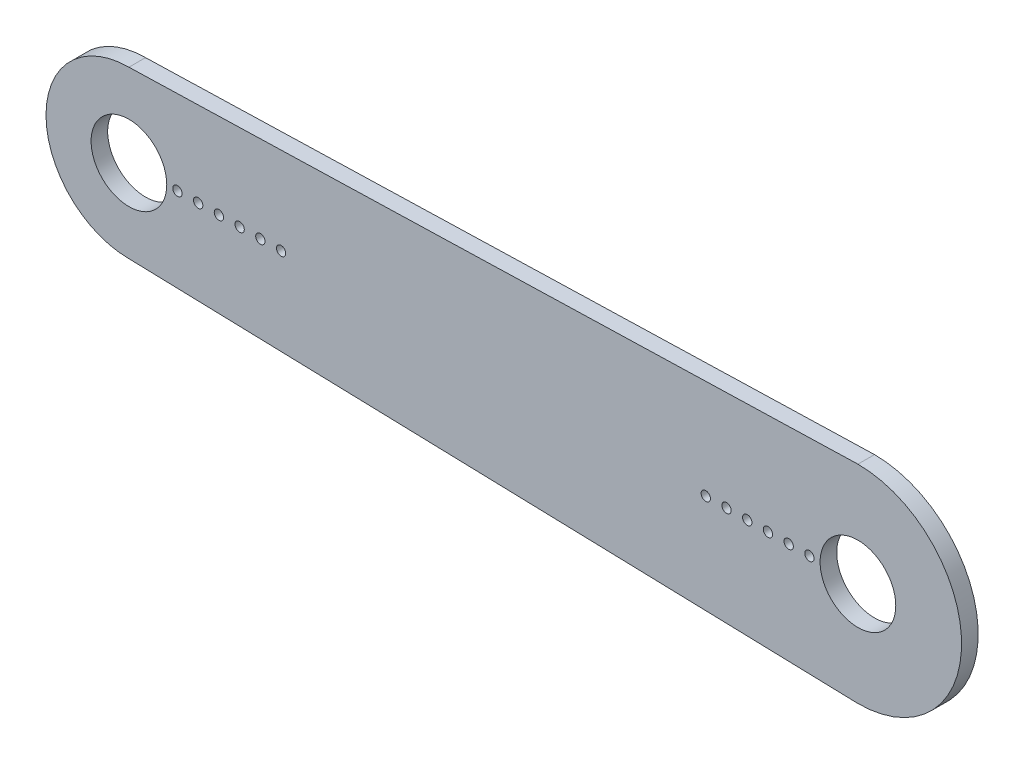
ISO-10303-21;
HEADER;
FILE_DESCRIPTION(('STEP AP214'),'2;1');
FILE_NAME('part.step','',(''),(''),'','','');
FILE_SCHEMA(('AUTOMOTIVE_DESIGN { 1 0 10303 214 1 1 1 1 }'));
ENDSEC;
DATA;
#1=APPLICATION_CONTEXT('core data for automotive mechanical design processes');
#2=APPLICATION_PROTOCOL_DEFINITION('international standard','automotive_design',2000,#1);
#3=PRODUCT_CONTEXT('',#1,'mechanical');
#4=PRODUCT('Part','Part','',(#3));
#5=PRODUCT_RELATED_PRODUCT_CATEGORY('part','',(#4));
#6=PRODUCT_DEFINITION_FORMATION('','',#4);
#7=PRODUCT_DEFINITION_CONTEXT('part definition',#1,'design');
#8=PRODUCT_DEFINITION('design','',#6,#7);
#9=PRODUCT_DEFINITION_SHAPE('','',#8);
#10=(LENGTH_UNIT() NAMED_UNIT(*) SI_UNIT(.MILLI.,.METRE.));
#11=(NAMED_UNIT(*) PLANE_ANGLE_UNIT() SI_UNIT($,.RADIAN.));
#12=(NAMED_UNIT(*) SI_UNIT($,.STERADIAN.) SOLID_ANGLE_UNIT());
#13=UNCERTAINTY_MEASURE_WITH_UNIT(LENGTH_MEASURE(1.E-05),#10,'distance_accuracy_value','');
#14=(GEOMETRIC_REPRESENTATION_CONTEXT(3) GLOBAL_UNCERTAINTY_ASSIGNED_CONTEXT((#13)) GLOBAL_UNIT_ASSIGNED_CONTEXT((#10,
#11,#12)) REPRESENTATION_CONTEXT('',''));
#15=CARTESIAN_POINT('',(0.,0.,0.));
#16=DIRECTION('',(0.,0.,1.));
#17=DIRECTION('',(1.,0.,0.));
#18=AXIS2_PLACEMENT_3D('',#15,#16,#17);
#19=CARTESIAN_POINT('',(-32.4159025710339,-9.07817709168111,1.6));
#20=DIRECTION('',(-0.028425875249851,-0.999595903161012,0.));
#21=DIRECTION('',(0.999595903161012,-0.028425875249851,0.));
#22=AXIS2_PLACEMENT_3D('',#19,#20,#21);
#23=PLANE('',#22);
#24=DIRECTION('',(-0.999595903161012,0.028425875249851,0.));
#25=VECTOR('',#24,1.);
#26=CARTESIAN_POINT('',(-32.4159025710339,-9.07817709168111,0.));
#27=LINE('',#26,#25);
#28=CARTESIAN_POINT('',(0.,-10.,0.));
#29=VERTEX_POINT('',#28);
#30=CARTESIAN_POINT('',(-70.33,-8.00000000000001,0.));
#31=VERTEX_POINT('',#30);
#32=EDGE_CURVE('E104',#29,#31,#27,.T.);
#33=ORIENTED_EDGE('',*,*,#32,.F.);
#34=DIRECTION('',(0.,0.,-1.));
#35=VECTOR('',#34,1.);
#36=CARTESIAN_POINT('',(0.,-10.,1.6));
#37=LINE('',#36,#35);
#38=CARTESIAN_POINT('',(0.,-10.,1.6));
#39=VERTEX_POINT('',#38);
#40=EDGE_CURVE('E11',#39,#29,#37,.T.);
#41=ORIENTED_EDGE('',*,*,#40,.F.);
#42=DIRECTION('',(-0.999595903161012,0.028425875249851,0.));
#43=VECTOR('',#42,1.);
#44=CARTESIAN_POINT('',(-32.4159025710339,-9.07817709168111,1.6));
#45=LINE('',#44,#43);
#46=CARTESIAN_POINT('',(-70.33,-8.00000000000001,1.6));
#47=VERTEX_POINT('',#46);
#48=EDGE_CURVE('E82',#39,#47,#45,.T.);
#49=ORIENTED_EDGE('',*,*,#48,.T.);
#50=DIRECTION('',(0.,0.,-1.));
#51=VECTOR('',#50,1.);
#52=CARTESIAN_POINT('',(-70.33,-8.00000000000001,1.6));
#53=LINE('',#52,#51);
#54=EDGE_CURVE('E72',#47,#31,#53,.T.);
#55=ORIENTED_EDGE('',*,*,#54,.T.);
#56=EDGE_LOOP('',(#33,#41,#49,#55));
#57=FACE_BOUND('',#56,.T.);
#58=ADVANCED_FACE('F33',(#57),#23,.T.);
#59=CARTESIAN_POINT('',(0.,0.,1.6));
#60=DIRECTION('',(0.,0.,-1.));
#61=DIRECTION('',(-1.,0.,0.));
#62=AXIS2_PLACEMENT_3D('',#59,#60,#61);
#63=CYLINDRICAL_SURFACE('',#62,10.);
#64=CARTESIAN_POINT('',(0.,0.,0.));
#65=DIRECTION('',(0.,0.,1.));
#66=DIRECTION('',(1.,0.,0.));
#67=AXIS2_PLACEMENT_3D('',#64,#65,#66);
#68=CIRCLE('',#67,10.);
#69=CARTESIAN_POINT('',(0.,9.99999999999999,0.));
#70=VERTEX_POINT('',#69);
#71=EDGE_CURVE('E88',#29,#70,#68,.T.);
#72=ORIENTED_EDGE('',*,*,#71,.T.);
#73=DIRECTION('',(0.,0.,-1.));
#74=VECTOR('',#73,1.);
#75=CARTESIAN_POINT('',(0.,9.99999999999999,1.6));
#76=LINE('',#75,#74);
#77=CARTESIAN_POINT('',(0.,9.99999999999999,1.6));
#78=VERTEX_POINT('',#77);
#79=EDGE_CURVE('E42',#78,#70,#76,.T.);
#80=ORIENTED_EDGE('',*,*,#79,.F.);
#81=CARTESIAN_POINT('',(0.,0.,1.6));
#82=DIRECTION('',(0.,0.,1.));
#83=DIRECTION('',(1.,0.,0.));
#84=AXIS2_PLACEMENT_3D('',#81,#82,#83);
#85=CIRCLE('',#84,10.);
#86=EDGE_CURVE('E77',#39,#78,#85,.T.);
#87=ORIENTED_EDGE('',*,*,#86,.F.);
#88=ORIENTED_EDGE('',*,*,#40,.T.);
#89=EDGE_LOOP('',(#72,#80,#87,#88));
#90=FACE_BOUND('',#89,.T.);
#91=ADVANCED_FACE('F86',(#90),#63,.T.);
#92=CARTESIAN_POINT('',(-36.4271724817168,8.96410713829895,1.6));
#93=DIRECTION('',(-0.0284258752498512,0.999595903161012,0.));
#94=DIRECTION('',(-0.999595903161012,-0.0284258752498512,0.));
#95=AXIS2_PLACEMENT_3D('',#92,#93,#94);
#96=PLANE('',#95);
#97=DIRECTION('',(0.999595903161012,0.0284258752498512,0.));
#98=VECTOR('',#97,1.);
#99=CARTESIAN_POINT('',(-36.4271724817168,8.96410713829895,0.));
#100=LINE('',#99,#98);
#101=CARTESIAN_POINT('',(-70.33,7.99999999999998,0.));
#102=VERTEX_POINT('',#101);
#103=EDGE_CURVE('E108',#102,#70,#100,.T.);
#104=ORIENTED_EDGE('',*,*,#103,.F.);
#105=DIRECTION('',(0.,0.,-1.));
#106=VECTOR('',#105,1.);
#107=CARTESIAN_POINT('',(-70.33,7.99999999999998,1.6));
#108=LINE('',#107,#106);
#109=CARTESIAN_POINT('',(-70.33,7.99999999999998,1.6));
#110=VERTEX_POINT('',#109);
#111=EDGE_CURVE('E65',#110,#102,#108,.T.);
#112=ORIENTED_EDGE('',*,*,#111,.F.);
#113=DIRECTION('',(0.999595903161012,0.0284258752498512,0.));
#114=VECTOR('',#113,1.);
#115=CARTESIAN_POINT('',(-36.4271724817168,8.96410713829895,1.6));
#116=LINE('',#115,#114);
#117=EDGE_CURVE('E81',#110,#78,#116,.T.);
#118=ORIENTED_EDGE('',*,*,#117,.T.);
#119=ORIENTED_EDGE('',*,*,#79,.T.);
#120=EDGE_LOOP('',(#104,#112,#118,#119));
#121=FACE_BOUND('',#120,.T.);
#122=ADVANCED_FACE('F92',(#121),#96,.T.);
#123=CARTESIAN_POINT('',(0.,0.,1.6));
#124=DIRECTION('',(0.,0.,-1.));
#125=DIRECTION('',(-1.,0.,0.));
#126=AXIS2_PLACEMENT_3D('',#123,#124,#125);
#127=CYLINDRICAL_SURFACE('',#126,3.65);
#128=CARTESIAN_POINT('',(0.,0.,1.6));
#129=DIRECTION('',(0.,0.,1.));
#130=DIRECTION('',(1.,0.,0.));
#131=AXIS2_PLACEMENT_3D('',#128,#129,#130);
#132=CIRCLE('',#131,3.65);
#133=CARTESIAN_POINT('',(3.65,0.,1.6));
#134=VERTEX_POINT('',#133);
#135=EDGE_CURVE('E115',#134,#134,#132,.T.);
#136=ORIENTED_EDGE('',*,*,#135,.T.);
#137=EDGE_LOOP('',(#136));
#138=FACE_BOUND('',#137,.T.);
#139=CARTESIAN_POINT('',(0.,0.,0.));
#140=DIRECTION('',(0.,0.,1.));
#141=DIRECTION('',(1.,0.,0.));
#142=AXIS2_PLACEMENT_3D('',#139,#140,#141);
#143=CIRCLE('',#142,3.65);
#144=CARTESIAN_POINT('',(3.65,0.,0.));
#145=VERTEX_POINT('',#144);
#146=EDGE_CURVE('E100',#145,#145,#143,.T.);
#147=ORIENTED_EDGE('',*,*,#146,.F.);
#148=EDGE_LOOP('',(#147));
#149=FACE_BOUND('',#148,.T.);
#150=ADVANCED_FACE('F130',(#138,#149),#127,.F.);
#151=CARTESIAN_POINT('',(-70.33,0.,1.6));
#152=DIRECTION('',(0.,0.,-1.));
#153=DIRECTION('',(-1.,0.,0.));
#154=AXIS2_PLACEMENT_3D('',#151,#152,#153);
#155=CYLINDRICAL_SURFACE('',#154,3.65);
#156=CARTESIAN_POINT('',(-70.33,0.,1.6));
#157=DIRECTION('',(0.,0.,1.));
#158=DIRECTION('',(1.,0.,0.));
#159=AXIS2_PLACEMENT_3D('',#156,#157,#158);
#160=CIRCLE('',#159,3.65);
#161=CARTESIAN_POINT('',(-66.68,0.,1.6));
#162=VERTEX_POINT('',#161);
#163=EDGE_CURVE('E112',#162,#162,#160,.T.);
#164=ORIENTED_EDGE('',*,*,#163,.T.);
#165=EDGE_LOOP('',(#164));
#166=FACE_BOUND('',#165,.T.);
#167=CARTESIAN_POINT('',(-70.33,0.,0.));
#168=DIRECTION('',(0.,0.,1.));
#169=DIRECTION('',(1.,0.,0.));
#170=AXIS2_PLACEMENT_3D('',#167,#168,#169);
#171=CIRCLE('',#170,3.65);
#172=CARTESIAN_POINT('',(-66.68,0.,0.));
#173=VERTEX_POINT('',#172);
#174=EDGE_CURVE('E97',#173,#173,#171,.T.);
#175=ORIENTED_EDGE('',*,*,#174,.F.);
#176=EDGE_LOOP('',(#175));
#177=FACE_BOUND('',#176,.T.);
#178=ADVANCED_FACE('F35',(#166,#177),#155,.F.);
#179=CARTESIAN_POINT('',(-70.33,0.,1.6));
#180=DIRECTION('',(0.,0.,-1.));
#181=DIRECTION('',(-1.,0.,0.));
#182=AXIS2_PLACEMENT_3D('',#179,#180,#181);
#183=CYLINDRICAL_SURFACE('',#182,8.);
#184=CARTESIAN_POINT('',(-70.33,0.,0.));
#185=DIRECTION('',(0.,0.,1.));
#186=DIRECTION('',(1.,0.,0.));
#187=AXIS2_PLACEMENT_3D('',#184,#185,#186);
#188=CIRCLE('',#187,8.);
#189=EDGE_CURVE('E110',#102,#31,#188,.T.);
#190=ORIENTED_EDGE('',*,*,#189,.T.);
#191=ORIENTED_EDGE('',*,*,#54,.F.);
#192=CARTESIAN_POINT('',(-70.33,0.,1.6));
#193=DIRECTION('',(0.,0.,1.));
#194=DIRECTION('',(1.,0.,0.));
#195=AXIS2_PLACEMENT_3D('',#192,#193,#194);
#196=CIRCLE('',#195,8.);
#197=EDGE_CURVE('E50',#110,#47,#196,.T.);
#198=ORIENTED_EDGE('',*,*,#197,.F.);
#199=ORIENTED_EDGE('',*,*,#111,.T.);
#200=EDGE_LOOP('',(#190,#191,#198,#199));
#201=FACE_BOUND('',#200,.T.);
#202=ADVANCED_FACE('F137',(#201),#183,.T.);
#203=CARTESIAN_POINT('',(-34.165,-70.585188181273,1.6));
#204=DIRECTION('',(0.,0.,1.));
#205=DIRECTION('',(1.,0.,0.));
#206=AXIS2_PLACEMENT_3D('',#203,#204,#205);
#207=PLANE('',#206);
#208=CARTESIAN_POINT('',(-55.65,0.,1.6));
#209=DIRECTION('',(0.,0.,1.));
#210=DIRECTION('',(1.,0.,0.));
#211=AXIS2_PLACEMENT_3D('',#208,#209,#210);
#212=CIRCLE('',#211,0.450000000000002);
#213=CARTESIAN_POINT('',(-55.2,0.,1.6));
#214=VERTEX_POINT('',#213);
#215=EDGE_CURVE('E295',#214,#214,#212,.T.);
#216=ORIENTED_EDGE('',*,*,#215,.F.);
#217=EDGE_LOOP('',(#216));
#218=FACE_BOUND('',#217,.T.);
#219=CARTESIAN_POINT('',(-57.65,0.,1.6));
#220=DIRECTION('',(0.,0.,1.));
#221=DIRECTION('',(1.,0.,0.));
#222=AXIS2_PLACEMENT_3D('',#219,#220,#221);
#223=CIRCLE('',#222,0.450000000000002);
#224=CARTESIAN_POINT('',(-57.2,0.,1.6));
#225=VERTEX_POINT('',#224);
#226=EDGE_CURVE('E298',#225,#225,#223,.T.);
#227=ORIENTED_EDGE('',*,*,#226,.F.);
#228=EDGE_LOOP('',(#227));
#229=FACE_BOUND('',#228,.T.);
#230=CARTESIAN_POINT('',(-59.65,0.,1.6));
#231=DIRECTION('',(0.,0.,1.));
#232=DIRECTION('',(1.,0.,0.));
#233=AXIS2_PLACEMENT_3D('',#230,#231,#232);
#234=CIRCLE('',#233,0.450000000000002);
#235=CARTESIAN_POINT('',(-59.2,0.,1.6));
#236=VERTEX_POINT('',#235);
#237=EDGE_CURVE('E307',#236,#236,#234,.T.);
#238=ORIENTED_EDGE('',*,*,#237,.F.);
#239=EDGE_LOOP('',(#238));
#240=FACE_BOUND('',#239,.T.);
#241=CARTESIAN_POINT('',(-61.65,0.,1.6));
#242=DIRECTION('',(0.,0.,1.));
#243=DIRECTION('',(1.,0.,0.));
#244=AXIS2_PLACEMENT_3D('',#241,#242,#243);
#245=CIRCLE('',#244,0.450000000000002);
#246=CARTESIAN_POINT('',(-61.2,0.,1.6));
#247=VERTEX_POINT('',#246);
#248=EDGE_CURVE('E313',#247,#247,#245,.T.);
#249=ORIENTED_EDGE('',*,*,#248,.F.);
#250=EDGE_LOOP('',(#249));
#251=FACE_BOUND('',#250,.T.);
#252=CARTESIAN_POINT('',(-63.65,0.,1.6));
#253=DIRECTION('',(0.,0.,1.));
#254=DIRECTION('',(1.,0.,0.));
#255=AXIS2_PLACEMENT_3D('',#252,#253,#254);
#256=CIRCLE('',#255,0.450000000000002);
#257=CARTESIAN_POINT('',(-63.2,0.,1.6));
#258=VERTEX_POINT('',#257);
#259=EDGE_CURVE('E319',#258,#258,#256,.T.);
#260=ORIENTED_EDGE('',*,*,#259,.F.);
#261=EDGE_LOOP('',(#260));
#262=FACE_BOUND('',#261,.T.);
#263=CARTESIAN_POINT('',(-14.68,0.,1.6));
#264=DIRECTION('',(0.,0.,1.));
#265=DIRECTION('',(1.,0.,0.));
#266=AXIS2_PLACEMENT_3D('',#263,#264,#265);
#267=CIRCLE('',#266,0.45);
#268=CARTESIAN_POINT('',(-14.23,0.,1.6));
#269=VERTEX_POINT('',#268);
#270=EDGE_CURVE('E325',#269,#269,#267,.T.);
#271=ORIENTED_EDGE('',*,*,#270,.F.);
#272=EDGE_LOOP('',(#271));
#273=FACE_BOUND('',#272,.T.);
#274=CARTESIAN_POINT('',(-12.68,0.,1.6));
#275=DIRECTION('',(0.,0.,1.));
#276=DIRECTION('',(1.,0.,0.));
#277=AXIS2_PLACEMENT_3D('',#274,#275,#276);
#278=CIRCLE('',#277,0.45);
#279=CARTESIAN_POINT('',(-12.23,0.,1.6));
#280=VERTEX_POINT('',#279);
#281=EDGE_CURVE('E331',#280,#280,#278,.T.);
#282=ORIENTED_EDGE('',*,*,#281,.F.);
#283=EDGE_LOOP('',(#282));
#284=FACE_BOUND('',#283,.T.);
#285=CARTESIAN_POINT('',(-10.68,0.,1.6));
#286=DIRECTION('',(0.,0.,1.));
#287=DIRECTION('',(1.,0.,0.));
#288=AXIS2_PLACEMENT_3D('',#285,#286,#287);
#289=CIRCLE('',#288,0.45);
#290=CARTESIAN_POINT('',(-10.23,0.,1.6));
#291=VERTEX_POINT('',#290);
#292=EDGE_CURVE('E337',#291,#291,#289,.T.);
#293=ORIENTED_EDGE('',*,*,#292,.F.);
#294=EDGE_LOOP('',(#293));
#295=FACE_BOUND('',#294,.T.);
#296=CARTESIAN_POINT('',(-8.68,0.,1.6));
#297=DIRECTION('',(0.,0.,1.));
#298=DIRECTION('',(1.,0.,0.));
#299=AXIS2_PLACEMENT_3D('',#296,#297,#298);
#300=CIRCLE('',#299,0.45);
#301=CARTESIAN_POINT('',(-8.23,0.,1.6));
#302=VERTEX_POINT('',#301);
#303=EDGE_CURVE('E343',#302,#302,#300,.T.);
#304=ORIENTED_EDGE('',*,*,#303,.F.);
#305=EDGE_LOOP('',(#304));
#306=FACE_BOUND('',#305,.T.);
#307=CARTESIAN_POINT('',(-6.68,0.,1.6));
#308=DIRECTION('',(0.,0.,1.));
#309=DIRECTION('',(1.,0.,0.));
#310=AXIS2_PLACEMENT_3D('',#307,#308,#309);
#311=CIRCLE('',#310,0.45);
#312=CARTESIAN_POINT('',(-6.23,0.,1.6));
#313=VERTEX_POINT('',#312);
#314=EDGE_CURVE('E349',#313,#313,#311,.T.);
#315=ORIENTED_EDGE('',*,*,#314,.F.);
#316=EDGE_LOOP('',(#315));
#317=FACE_BOUND('',#316,.T.);
#318=CARTESIAN_POINT('',(-4.68,0.,1.6));
#319=DIRECTION('',(0.,0.,1.));
#320=DIRECTION('',(1.,0.,0.));
#321=AXIS2_PLACEMENT_3D('',#318,#319,#320);
#322=CIRCLE('',#321,0.45);
#323=CARTESIAN_POINT('',(-4.23,0.,1.6));
#324=VERTEX_POINT('',#323);
#325=EDGE_CURVE('E355',#324,#324,#322,.T.);
#326=ORIENTED_EDGE('',*,*,#325,.F.);
#327=EDGE_LOOP('',(#326));
#328=FACE_BOUND('',#327,.T.);
#329=CARTESIAN_POINT('',(-65.65,0.,1.6));
#330=DIRECTION('',(0.,0.,1.));
#331=DIRECTION('',(1.,0.,0.));
#332=AXIS2_PLACEMENT_3D('',#329,#330,#331);
#333=CIRCLE('',#332,0.450000000000002);
#334=CARTESIAN_POINT('',(-65.2,0.,1.6));
#335=VERTEX_POINT('',#334);
#336=EDGE_CURVE('E360',#335,#335,#333,.T.);
#337=ORIENTED_EDGE('',*,*,#336,.F.);
#338=EDGE_LOOP('',(#337));
#339=FACE_BOUND('',#338,.T.);
#340=ORIENTED_EDGE('',*,*,#163,.F.);
#341=EDGE_LOOP('',(#340));
#342=FACE_BOUND('',#341,.T.);
#343=ORIENTED_EDGE('',*,*,#135,.F.);
#344=EDGE_LOOP('',(#343));
#345=FACE_BOUND('',#344,.T.);
#346=ORIENTED_EDGE('',*,*,#48,.F.);
#347=ORIENTED_EDGE('',*,*,#86,.T.);
#348=ORIENTED_EDGE('',*,*,#117,.F.);
#349=ORIENTED_EDGE('',*,*,#197,.T.);
#350=EDGE_LOOP('',(#346,#347,#348,#349));
#351=FACE_BOUND('',#350,.T.);
#352=ADVANCED_FACE('F79',(#218,#229,#240,#251,#262,#273,#284,#295,#306,#317,#328,#339,#342,#345,
#351),#207,.T.);
#353=CARTESIAN_POINT('',(-34.165,-70.585188181273,0.));
#354=DIRECTION('',(0.,0.,1.));
#355=DIRECTION('',(1.,0.,0.));
#356=AXIS2_PLACEMENT_3D('',#353,#354,#355);
#357=PLANE('',#356);
#358=CARTESIAN_POINT('',(-55.65,0.,0.));
#359=DIRECTION('',(0.,0.,1.));
#360=DIRECTION('',(1.,0.,0.));
#361=AXIS2_PLACEMENT_3D('',#358,#359,#360);
#362=CIRCLE('',#361,0.450000000000002);
#363=CARTESIAN_POINT('',(-55.2,0.,0.));
#364=VERTEX_POINT('',#363);
#365=EDGE_CURVE('E297',#364,#364,#362,.F.);
#366=ORIENTED_EDGE('',*,*,#365,.F.);
#367=EDGE_LOOP('',(#366));
#368=FACE_BOUND('',#367,.T.);
#369=CARTESIAN_POINT('',(-57.65,0.,0.));
#370=DIRECTION('',(0.,0.,1.));
#371=DIRECTION('',(1.,0.,0.));
#372=AXIS2_PLACEMENT_3D('',#369,#370,#371);
#373=CIRCLE('',#372,0.450000000000002);
#374=CARTESIAN_POINT('',(-57.2,0.,0.));
#375=VERTEX_POINT('',#374);
#376=EDGE_CURVE('E301',#375,#375,#373,.F.);
#377=ORIENTED_EDGE('',*,*,#376,.F.);
#378=EDGE_LOOP('',(#377));
#379=FACE_BOUND('',#378,.T.);
#380=CARTESIAN_POINT('',(-59.65,0.,0.));
#381=DIRECTION('',(0.,0.,1.));
#382=DIRECTION('',(1.,0.,0.));
#383=AXIS2_PLACEMENT_3D('',#380,#381,#382);
#384=CIRCLE('',#383,0.450000000000002);
#385=CARTESIAN_POINT('',(-59.2,0.,0.));
#386=VERTEX_POINT('',#385);
#387=EDGE_CURVE('E310',#386,#386,#384,.F.);
#388=ORIENTED_EDGE('',*,*,#387,.F.);
#389=EDGE_LOOP('',(#388));
#390=FACE_BOUND('',#389,.T.);
#391=CARTESIAN_POINT('',(-61.65,0.,0.));
#392=DIRECTION('',(0.,0.,1.));
#393=DIRECTION('',(1.,0.,0.));
#394=AXIS2_PLACEMENT_3D('',#391,#392,#393);
#395=CIRCLE('',#394,0.450000000000002);
#396=CARTESIAN_POINT('',(-61.2,0.,0.));
#397=VERTEX_POINT('',#396);
#398=EDGE_CURVE('E316',#397,#397,#395,.F.);
#399=ORIENTED_EDGE('',*,*,#398,.F.);
#400=EDGE_LOOP('',(#399));
#401=FACE_BOUND('',#400,.T.);
#402=CARTESIAN_POINT('',(-63.65,0.,0.));
#403=DIRECTION('',(0.,0.,1.));
#404=DIRECTION('',(1.,0.,0.));
#405=AXIS2_PLACEMENT_3D('',#402,#403,#404);
#406=CIRCLE('',#405,0.450000000000002);
#407=CARTESIAN_POINT('',(-63.2,0.,0.));
#408=VERTEX_POINT('',#407);
#409=EDGE_CURVE('E322',#408,#408,#406,.F.);
#410=ORIENTED_EDGE('',*,*,#409,.F.);
#411=EDGE_LOOP('',(#410));
#412=FACE_BOUND('',#411,.T.);
#413=CARTESIAN_POINT('',(-14.68,0.,0.));
#414=DIRECTION('',(0.,0.,1.));
#415=DIRECTION('',(1.,0.,0.));
#416=AXIS2_PLACEMENT_3D('',#413,#414,#415);
#417=CIRCLE('',#416,0.45);
#418=CARTESIAN_POINT('',(-14.23,0.,0.));
#419=VERTEX_POINT('',#418);
#420=EDGE_CURVE('E328',#419,#419,#417,.F.);
#421=ORIENTED_EDGE('',*,*,#420,.F.);
#422=EDGE_LOOP('',(#421));
#423=FACE_BOUND('',#422,.T.);
#424=CARTESIAN_POINT('',(-12.68,0.,0.));
#425=DIRECTION('',(0.,0.,1.));
#426=DIRECTION('',(1.,0.,0.));
#427=AXIS2_PLACEMENT_3D('',#424,#425,#426);
#428=CIRCLE('',#427,0.45);
#429=CARTESIAN_POINT('',(-12.23,0.,0.));
#430=VERTEX_POINT('',#429);
#431=EDGE_CURVE('E334',#430,#430,#428,.F.);
#432=ORIENTED_EDGE('',*,*,#431,.F.);
#433=EDGE_LOOP('',(#432));
#434=FACE_BOUND('',#433,.T.);
#435=CARTESIAN_POINT('',(-10.68,0.,0.));
#436=DIRECTION('',(0.,0.,1.));
#437=DIRECTION('',(1.,0.,0.));
#438=AXIS2_PLACEMENT_3D('',#435,#436,#437);
#439=CIRCLE('',#438,0.45);
#440=CARTESIAN_POINT('',(-10.23,0.,0.));
#441=VERTEX_POINT('',#440);
#442=EDGE_CURVE('E340',#441,#441,#439,.F.);
#443=ORIENTED_EDGE('',*,*,#442,.F.);
#444=EDGE_LOOP('',(#443));
#445=FACE_BOUND('',#444,.T.);
#446=CARTESIAN_POINT('',(-8.68,0.,0.));
#447=DIRECTION('',(0.,0.,1.));
#448=DIRECTION('',(1.,0.,0.));
#449=AXIS2_PLACEMENT_3D('',#446,#447,#448);
#450=CIRCLE('',#449,0.45);
#451=CARTESIAN_POINT('',(-8.23,0.,0.));
#452=VERTEX_POINT('',#451);
#453=EDGE_CURVE('E346',#452,#452,#450,.F.);
#454=ORIENTED_EDGE('',*,*,#453,.F.);
#455=EDGE_LOOP('',(#454));
#456=FACE_BOUND('',#455,.T.);
#457=CARTESIAN_POINT('',(-6.68,0.,0.));
#458=DIRECTION('',(0.,0.,1.));
#459=DIRECTION('',(1.,0.,0.));
#460=AXIS2_PLACEMENT_3D('',#457,#458,#459);
#461=CIRCLE('',#460,0.45);
#462=CARTESIAN_POINT('',(-6.23,0.,0.));
#463=VERTEX_POINT('',#462);
#464=EDGE_CURVE('E352',#463,#463,#461,.F.);
#465=ORIENTED_EDGE('',*,*,#464,.F.);
#466=EDGE_LOOP('',(#465));
#467=FACE_BOUND('',#466,.T.);
#468=CARTESIAN_POINT('',(-4.68,0.,0.));
#469=DIRECTION('',(0.,0.,1.));
#470=DIRECTION('',(1.,0.,0.));
#471=AXIS2_PLACEMENT_3D('',#468,#469,#470);
#472=CIRCLE('',#471,0.45);
#473=CARTESIAN_POINT('',(-4.23,0.,0.));
#474=VERTEX_POINT('',#473);
#475=EDGE_CURVE('E358',#474,#474,#472,.F.);
#476=ORIENTED_EDGE('',*,*,#475,.F.);
#477=EDGE_LOOP('',(#476));
#478=FACE_BOUND('',#477,.T.);
#479=CARTESIAN_POINT('',(-65.65,0.,0.));
#480=DIRECTION('',(0.,0.,1.));
#481=DIRECTION('',(1.,0.,0.));
#482=AXIS2_PLACEMENT_3D('',#479,#480,#481);
#483=CIRCLE('',#482,0.450000000000002);
#484=CARTESIAN_POINT('',(-65.2,0.,0.));
#485=VERTEX_POINT('',#484);
#486=EDGE_CURVE('E101',#485,#485,#483,.F.);
#487=ORIENTED_EDGE('',*,*,#486,.F.);
#488=EDGE_LOOP('',(#487));
#489=FACE_BOUND('',#488,.T.);
#490=ORIENTED_EDGE('',*,*,#174,.T.);
#491=EDGE_LOOP('',(#490));
#492=FACE_BOUND('',#491,.T.);
#493=ORIENTED_EDGE('',*,*,#146,.T.);
#494=EDGE_LOOP('',(#493));
#495=FACE_BOUND('',#494,.T.);
#496=ORIENTED_EDGE('',*,*,#32,.T.);
#497=ORIENTED_EDGE('',*,*,#189,.F.);
#498=ORIENTED_EDGE('',*,*,#103,.T.);
#499=ORIENTED_EDGE('',*,*,#71,.F.);
#500=EDGE_LOOP('',(#496,#497,#498,#499));
#501=FACE_BOUND('',#500,.T.);
#502=ADVANCED_FACE('F142',(#368,#379,#390,#401,#412,#423,#434,#445,#456,#467,#478,#489,#492,
#495,#501),#357,.F.);
#503=CARTESIAN_POINT('',(-65.65,0.,-0.000999999999999916));
#504=DIRECTION('',(0.,0.,1.));
#505=DIRECTION('',(1.,0.,0.));
#506=AXIS2_PLACEMENT_3D('',#503,#504,#505);
#507=CYLINDRICAL_SURFACE('',#506,0.450000000000002);
#508=ORIENTED_EDGE('',*,*,#336,.T.);
#509=EDGE_LOOP('',(#508));
#510=FACE_BOUND('',#509,.T.);
#511=ORIENTED_EDGE('',*,*,#486,.T.);
#512=EDGE_LOOP('',(#511));
#513=FACE_BOUND('',#512,.T.);
#514=ADVANCED_FACE('F145',(#510,#513),#507,.F.);
#515=CARTESIAN_POINT('',(-4.68,0.,-0.000999999999999916));
#516=DIRECTION('',(0.,0.,1.));
#517=DIRECTION('',(1.,0.,0.));
#518=AXIS2_PLACEMENT_3D('',#515,#516,#517);
#519=CYLINDRICAL_SURFACE('',#518,0.45);
#520=ORIENTED_EDGE('',*,*,#325,.T.);
#521=EDGE_LOOP('',(#520));
#522=FACE_BOUND('',#521,.T.);
#523=ORIENTED_EDGE('',*,*,#475,.T.);
#524=EDGE_LOOP('',(#523));
#525=FACE_BOUND('',#524,.T.);
#526=ADVANCED_FACE('F152',(#522,#525),#519,.F.);
#527=CARTESIAN_POINT('',(-6.68,0.,-0.000999999999999916));
#528=DIRECTION('',(0.,0.,1.));
#529=DIRECTION('',(1.,0.,0.));
#530=AXIS2_PLACEMENT_3D('',#527,#528,#529);
#531=CYLINDRICAL_SURFACE('',#530,0.45);
#532=ORIENTED_EDGE('',*,*,#314,.T.);
#533=EDGE_LOOP('',(#532));
#534=FACE_BOUND('',#533,.T.);
#535=ORIENTED_EDGE('',*,*,#464,.T.);
#536=EDGE_LOOP('',(#535));
#537=FACE_BOUND('',#536,.T.);
#538=ADVANCED_FACE('F188',(#534,#537),#531,.F.);
#539=CARTESIAN_POINT('',(-8.68,0.,-0.000999999999999916));
#540=DIRECTION('',(0.,0.,1.));
#541=DIRECTION('',(1.,0.,0.));
#542=AXIS2_PLACEMENT_3D('',#539,#540,#541);
#543=CYLINDRICAL_SURFACE('',#542,0.45);
#544=ORIENTED_EDGE('',*,*,#303,.T.);
#545=EDGE_LOOP('',(#544));
#546=FACE_BOUND('',#545,.T.);
#547=ORIENTED_EDGE('',*,*,#453,.T.);
#548=EDGE_LOOP('',(#547));
#549=FACE_BOUND('',#548,.T.);
#550=ADVANCED_FACE('F198',(#546,#549),#543,.F.);
#551=CARTESIAN_POINT('',(-10.68,0.,-0.000999999999999916));
#552=DIRECTION('',(0.,0.,1.));
#553=DIRECTION('',(1.,0.,0.));
#554=AXIS2_PLACEMENT_3D('',#551,#552,#553);
#555=CYLINDRICAL_SURFACE('',#554,0.45);
#556=ORIENTED_EDGE('',*,*,#292,.T.);
#557=EDGE_LOOP('',(#556));
#558=FACE_BOUND('',#557,.T.);
#559=ORIENTED_EDGE('',*,*,#442,.T.);
#560=EDGE_LOOP('',(#559));
#561=FACE_BOUND('',#560,.T.);
#562=ADVANCED_FACE('F208',(#558,#561),#555,.F.);
#563=CARTESIAN_POINT('',(-12.68,0.,-0.000999999999999916));
#564=DIRECTION('',(0.,0.,1.));
#565=DIRECTION('',(1.,0.,0.));
#566=AXIS2_PLACEMENT_3D('',#563,#564,#565);
#567=CYLINDRICAL_SURFACE('',#566,0.45);
#568=ORIENTED_EDGE('',*,*,#281,.T.);
#569=EDGE_LOOP('',(#568));
#570=FACE_BOUND('',#569,.T.);
#571=ORIENTED_EDGE('',*,*,#431,.T.);
#572=EDGE_LOOP('',(#571));
#573=FACE_BOUND('',#572,.T.);
#574=ADVANCED_FACE('F218',(#570,#573),#567,.F.);
#575=CARTESIAN_POINT('',(-14.68,0.,-0.000999999999999916));
#576=DIRECTION('',(0.,0.,1.));
#577=DIRECTION('',(1.,0.,0.));
#578=AXIS2_PLACEMENT_3D('',#575,#576,#577);
#579=CYLINDRICAL_SURFACE('',#578,0.45);
#580=ORIENTED_EDGE('',*,*,#270,.T.);
#581=EDGE_LOOP('',(#580));
#582=FACE_BOUND('',#581,.T.);
#583=ORIENTED_EDGE('',*,*,#420,.T.);
#584=EDGE_LOOP('',(#583));
#585=FACE_BOUND('',#584,.T.);
#586=ADVANCED_FACE('F228',(#582,#585),#579,.F.);
#587=CARTESIAN_POINT('',(-63.65,0.,-0.000999999999999916));
#588=DIRECTION('',(0.,0.,1.));
#589=DIRECTION('',(1.,0.,0.));
#590=AXIS2_PLACEMENT_3D('',#587,#588,#589);
#591=CYLINDRICAL_SURFACE('',#590,0.450000000000002);
#592=ORIENTED_EDGE('',*,*,#259,.T.);
#593=EDGE_LOOP('',(#592));
#594=FACE_BOUND('',#593,.T.);
#595=ORIENTED_EDGE('',*,*,#409,.T.);
#596=EDGE_LOOP('',(#595));
#597=FACE_BOUND('',#596,.T.);
#598=ADVANCED_FACE('F238',(#594,#597),#591,.F.);
#599=CARTESIAN_POINT('',(-61.65,0.,-0.000999999999999916));
#600=DIRECTION('',(0.,0.,1.));
#601=DIRECTION('',(1.,0.,0.));
#602=AXIS2_PLACEMENT_3D('',#599,#600,#601);
#603=CYLINDRICAL_SURFACE('',#602,0.450000000000002);
#604=ORIENTED_EDGE('',*,*,#248,.T.);
#605=EDGE_LOOP('',(#604));
#606=FACE_BOUND('',#605,.T.);
#607=ORIENTED_EDGE('',*,*,#398,.T.);
#608=EDGE_LOOP('',(#607));
#609=FACE_BOUND('',#608,.T.);
#610=ADVANCED_FACE('F248',(#606,#609),#603,.F.);
#611=CARTESIAN_POINT('',(-59.65,0.,-0.000999999999999916));
#612=DIRECTION('',(0.,0.,1.));
#613=DIRECTION('',(1.,0.,0.));
#614=AXIS2_PLACEMENT_3D('',#611,#612,#613);
#615=CYLINDRICAL_SURFACE('',#614,0.450000000000002);
#616=ORIENTED_EDGE('',*,*,#237,.T.);
#617=EDGE_LOOP('',(#616));
#618=FACE_BOUND('',#617,.T.);
#619=ORIENTED_EDGE('',*,*,#387,.T.);
#620=EDGE_LOOP('',(#619));
#621=FACE_BOUND('',#620,.T.);
#622=ADVANCED_FACE('F258',(#618,#621),#615,.F.);
#623=CARTESIAN_POINT('',(-57.65,0.,-0.000999999999999916));
#624=DIRECTION('',(0.,0.,1.));
#625=DIRECTION('',(1.,0.,0.));
#626=AXIS2_PLACEMENT_3D('',#623,#624,#625);
#627=CYLINDRICAL_SURFACE('',#626,0.450000000000002);
#628=ORIENTED_EDGE('',*,*,#226,.T.);
#629=EDGE_LOOP('',(#628));
#630=FACE_BOUND('',#629,.T.);
#631=ORIENTED_EDGE('',*,*,#376,.T.);
#632=EDGE_LOOP('',(#631));
#633=FACE_BOUND('',#632,.T.);
#634=ADVANCED_FACE('F268',(#630,#633),#627,.F.);
#635=CARTESIAN_POINT('',(-55.65,0.,-0.000999999999999916));
#636=DIRECTION('',(0.,0.,1.));
#637=DIRECTION('',(1.,0.,0.));
#638=AXIS2_PLACEMENT_3D('',#635,#636,#637);
#639=CYLINDRICAL_SURFACE('',#638,0.450000000000002);
#640=ORIENTED_EDGE('',*,*,#215,.T.);
#641=EDGE_LOOP('',(#640));
#642=FACE_BOUND('',#641,.T.);
#643=ORIENTED_EDGE('',*,*,#365,.T.);
#644=EDGE_LOOP('',(#643));
#645=FACE_BOUND('',#644,.T.);
#646=ADVANCED_FACE('F278',(#642,#645),#639,.F.);
#647=CLOSED_SHELL('',(#58,#91,#122,#150,#178,#202,#352,#502,#514,#526,#538,#550,#562,#574,#586,
#598,#610,#622,#634,#646));
#648=MANIFOLD_SOLID_BREP('B2',#647);
#649=ADVANCED_BREP_SHAPE_REPRESENTATION('',(#18,#648),#14);
#650=SHAPE_DEFINITION_REPRESENTATION(#9,#649);
ENDSEC;
END-ISO-10303-21;
